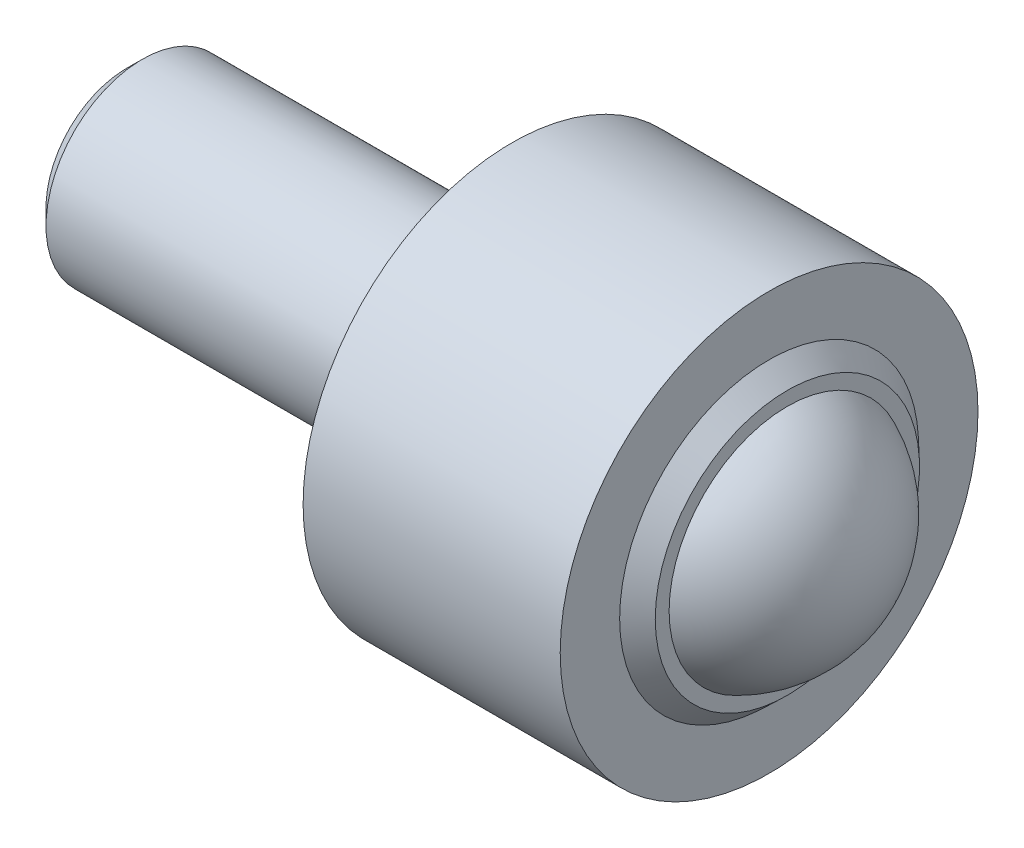
ISO-10303-21;
HEADER;
FILE_DESCRIPTION(('STEP AP214'),'2;1');
FILE_NAME('part.step','',(''),(''),'','','');
FILE_SCHEMA(('AUTOMOTIVE_DESIGN { 1 0 10303 214 1 1 1 1 }'));
ENDSEC;
DATA;
#1=APPLICATION_CONTEXT('core data for automotive mechanical design processes');
#2=APPLICATION_PROTOCOL_DEFINITION('international standard','automotive_design',2000,#1);
#3=PRODUCT_CONTEXT('',#1,'mechanical');
#4=PRODUCT('Part','Part','',(#3));
#5=PRODUCT_RELATED_PRODUCT_CATEGORY('part','',(#4));
#6=PRODUCT_DEFINITION_FORMATION('','',#4);
#7=PRODUCT_DEFINITION_CONTEXT('part definition',#1,'design');
#8=PRODUCT_DEFINITION('design','',#6,#7);
#9=PRODUCT_DEFINITION_SHAPE('','',#8);
#10=(LENGTH_UNIT() NAMED_UNIT(*) SI_UNIT(.MILLI.,.METRE.));
#11=(NAMED_UNIT(*) PLANE_ANGLE_UNIT() SI_UNIT($,.RADIAN.));
#12=(NAMED_UNIT(*) SI_UNIT($,.STERADIAN.) SOLID_ANGLE_UNIT());
#13=UNCERTAINTY_MEASURE_WITH_UNIT(LENGTH_MEASURE(1.E-05),#10,'distance_accuracy_value','');
#14=(GEOMETRIC_REPRESENTATION_CONTEXT(3) GLOBAL_UNCERTAINTY_ASSIGNED_CONTEXT((#13)) GLOBAL_UNIT_ASSIGNED_CONTEXT((#10,
#11,#12)) REPRESENTATION_CONTEXT('',''));
#15=CARTESIAN_POINT('',(0.,0.,0.));
#16=DIRECTION('',(0.,0.,1.));
#17=DIRECTION('',(1.,0.,0.));
#18=AXIS2_PLACEMENT_3D('',#15,#16,#17);
#19=CARTESIAN_POINT('',(12.,0.,0.));
#20=DIRECTION('',(-1.,0.,0.));
#21=DIRECTION('',(0.,0.,1.));
#22=AXIS2_PLACEMENT_3D('',#19,#20,#21);
#23=CYLINDRICAL_SURFACE('',#22,3.);
#24=CARTESIAN_POINT('',(0.5,0.,0.));
#25=DIRECTION('',(1.,0.,0.));
#26=DIRECTION('',(0.,0.,-1.));
#27=AXIS2_PLACEMENT_3D('',#24,#25,#26);
#28=CIRCLE('',#27,3.);
#29=CARTESIAN_POINT('',(0.5,0.,-3.));
#30=VERTEX_POINT('',#29);
#31=EDGE_CURVE('E39',#30,#30,#28,.T.);
#32=ORIENTED_EDGE('',*,*,#31,.T.);
#33=EDGE_LOOP('',(#32));
#34=FACE_BOUND('',#33,.T.);
#35=CARTESIAN_POINT('',(12.,0.,0.));
#36=DIRECTION('',(1.,0.,0.));
#37=DIRECTION('',(0.,0.,-1.));
#38=AXIS2_PLACEMENT_3D('',#35,#36,#37);
#39=CIRCLE('',#38,3.);
#40=CARTESIAN_POINT('',(12.,0.,-3.));
#41=VERTEX_POINT('',#40);
#42=EDGE_CURVE('E43',#41,#41,#39,.T.);
#43=ORIENTED_EDGE('',*,*,#42,.F.);
#44=EDGE_LOOP('',(#43));
#45=FACE_BOUND('',#44,.T.);
#46=ADVANCED_FACE('F32',(#34,#45),#23,.T.);
#47=CARTESIAN_POINT('',(0.,0.,0.));
#48=DIRECTION('',(1.,0.,0.));
#49=DIRECTION('',(0.,0.,-1.));
#50=AXIS2_PLACEMENT_3D('',#47,#48,#49);
#51=PLANE('',#50);
#52=CARTESIAN_POINT('',(0.,0.,0.));
#53=DIRECTION('',(1.,0.,0.));
#54=DIRECTION('',(0.,0.,-1.));
#55=AXIS2_PLACEMENT_3D('',#52,#53,#54);
#56=CIRCLE('',#55,2.5);
#57=CARTESIAN_POINT('',(0.,0.,-2.5));
#58=VERTEX_POINT('',#57);
#59=EDGE_CURVE('E10',#58,#58,#56,.F.);
#60=ORIENTED_EDGE('',*,*,#59,.T.);
#61=EDGE_LOOP('',(#60));
#62=FACE_BOUND('',#61,.T.);
#63=ADVANCED_FACE('F92',(#62),#51,.F.);
#64=CARTESIAN_POINT('',(20.,0.,0.));
#65=DIRECTION('',(-1.,0.,0.));
#66=DIRECTION('',(0.,0.,1.));
#67=AXIS2_PLACEMENT_3D('',#64,#65,#66);
#68=CYLINDRICAL_SURFACE('',#67,6.5);
#69=CARTESIAN_POINT('',(20.,0.,0.));
#70=DIRECTION('',(1.,0.,0.));
#71=DIRECTION('',(0.,0.,-1.));
#72=AXIS2_PLACEMENT_3D('',#69,#70,#71);
#73=CIRCLE('',#72,6.5);
#74=CARTESIAN_POINT('',(20.,0.,-6.5));
#75=VERTEX_POINT('',#74);
#76=EDGE_CURVE('E47',#75,#75,#73,.T.);
#77=ORIENTED_EDGE('',*,*,#76,.F.);
#78=EDGE_LOOP('',(#77));
#79=FACE_BOUND('',#78,.T.);
#80=CARTESIAN_POINT('',(12.,0.,0.));
#81=DIRECTION('',(1.,0.,0.));
#82=DIRECTION('',(0.,0.,-1.));
#83=AXIS2_PLACEMENT_3D('',#80,#81,#82);
#84=CIRCLE('',#83,6.5);
#85=CARTESIAN_POINT('',(12.,0.,-6.5));
#86=VERTEX_POINT('',#85);
#87=EDGE_CURVE('E50',#86,#86,#84,.T.);
#88=ORIENTED_EDGE('',*,*,#87,.T.);
#89=EDGE_LOOP('',(#88));
#90=FACE_BOUND('',#89,.T.);
#91=ADVANCED_FACE('F97',(#79,#90),#68,.T.);
#92=CARTESIAN_POINT('',(20.,0.,0.));
#93=DIRECTION('',(1.,0.,0.));
#94=DIRECTION('',(0.,0.,-1.));
#95=AXIS2_PLACEMENT_3D('',#92,#93,#94);
#96=PLANE('',#95);
#97=CARTESIAN_POINT('',(20.,0.,0.));
#98=DIRECTION('',(-1.,0.,0.));
#99=DIRECTION('',(0.,0.,1.));
#100=AXIS2_PLACEMENT_3D('',#97,#98,#99);
#101=CIRCLE('',#100,4.65086537431426);
#102=CARTESIAN_POINT('',(20.,0.,4.65086537431426));
#103=VERTEX_POINT('',#102);
#104=EDGE_CURVE('E61',#103,#103,#101,.T.);
#105=ORIENTED_EDGE('',*,*,#104,.T.);
#106=EDGE_LOOP('',(#105));
#107=FACE_BOUND('',#106,.T.);
#108=ORIENTED_EDGE('',*,*,#76,.T.);
#109=EDGE_LOOP('',(#108));
#110=FACE_BOUND('',#109,.T.);
#111=ADVANCED_FACE('F65',(#107,#110),#96,.T.);
#112=CARTESIAN_POINT('',(12.,0.,0.));
#113=DIRECTION('',(1.,0.,0.));
#114=DIRECTION('',(0.,0.,-1.));
#115=AXIS2_PLACEMENT_3D('',#112,#113,#114);
#116=PLANE('',#115);
#117=ORIENTED_EDGE('',*,*,#42,.T.);
#118=EDGE_LOOP('',(#117));
#119=FACE_BOUND('',#118,.T.);
#120=ORIENTED_EDGE('',*,*,#87,.F.);
#121=EDGE_LOOP('',(#120));
#122=FACE_BOUND('',#121,.T.);
#123=ADVANCED_FACE('F82',(#119,#122),#116,.F.);
#124=CARTESIAN_POINT('',(19.,0.,0.));
#125=DIRECTION('',(-1.,0.,0.));
#126=DIRECTION('',(0.,0.,1.));
#127=AXIS2_PLACEMENT_3D('',#124,#125,#126);
#128=SPHERICAL_SURFACE('',#127,4.);
#129=CARTESIAN_POINT('',(20.5681338920704,0.,0.));
#130=DIRECTION('',(-1.,0.,0.));
#131=DIRECTION('',(0.,0.,1.));
#132=AXIS2_PLACEMENT_3D('',#129,#130,#131);
#133=CIRCLE('',#132,3.6798038122351);
#134=CARTESIAN_POINT('',(20.5681338920704,0.,3.6798038122351));
#135=VERTEX_POINT('',#134);
#136=EDGE_CURVE('E53',#135,#135,#133,.T.);
#137=ORIENTED_EDGE('',*,*,#136,.F.);
#138=EDGE_LOOP('',(#137));
#139=FACE_BOUND('',#138,.T.);
#140=ADVANCED_FACE('F77',(#139),#128,.T.);
#141=CARTESIAN_POINT('',(20.5681338920704,0.,-4.11099415781164));
#142=DIRECTION('',(-1.,0.,0.));
#143=DIRECTION('',(0.,0.,1.));
#144=AXIS2_PLACEMENT_3D('',#141,#142,#143);
#145=PLANE('',#144);
#146=CARTESIAN_POINT('',(20.5681338920704,0.,0.));
#147=DIRECTION('',(-1.,0.,0.));
#148=DIRECTION('',(0.,0.,1.));
#149=AXIS2_PLACEMENT_3D('',#146,#147,#148);
#150=CIRCLE('',#149,4.11099415781164);
#151=CARTESIAN_POINT('',(20.5681338920704,0.,4.11099415781164));
#152=VERTEX_POINT('',#151);
#153=EDGE_CURVE('E58',#152,#152,#150,.T.);
#154=ORIENTED_EDGE('',*,*,#153,.F.);
#155=EDGE_LOOP('',(#154));
#156=FACE_BOUND('',#155,.T.);
#157=ORIENTED_EDGE('',*,*,#136,.T.);
#158=EDGE_LOOP('',(#157));
#159=FACE_BOUND('',#158,.T.);
#160=ADVANCED_FACE('F71',(#156,#159),#145,.F.);
#161=CARTESIAN_POINT('',(20.5681338920704,0.,0.));
#162=DIRECTION('',(-1.,0.,0.));
#163=DIRECTION('',(0.,0.,1.));
#164=AXIS2_PLACEMENT_3D('',#161,#162,#163);
#165=CONICAL_SURFACE('',#164,4.11099415781164,0.759895981051894);
#166=ORIENTED_EDGE('',*,*,#104,.F.);
#167=EDGE_LOOP('',(#166));
#168=FACE_BOUND('',#167,.T.);
#169=ORIENTED_EDGE('',*,*,#153,.T.);
#170=EDGE_LOOP('',(#169));
#171=FACE_BOUND('',#170,.T.);
#172=ADVANCED_FACE('F68',(#168,#171),#165,.T.);
#173=CARTESIAN_POINT('',(0.5,0.,0.));
#174=DIRECTION('',(1.,0.,0.));
#175=DIRECTION('',(0.,0.,-1.));
#176=AXIS2_PLACEMENT_3D('',#173,#174,#175);
#177=CONICAL_SURFACE('',#176,3.,0.785398163397452);
#178=ORIENTED_EDGE('',*,*,#59,.F.);
#179=EDGE_LOOP('',(#178));
#180=FACE_BOUND('',#179,.T.);
#181=ORIENTED_EDGE('',*,*,#31,.F.);
#182=EDGE_LOOP('',(#181));
#183=FACE_BOUND('',#182,.T.);
#184=ADVANCED_FACE('F34',(#180,#183),#177,.T.);
#185=CLOSED_SHELL('',(#46,#63,#91,#111,#123,#140,#160,#172,#184));
#186=MANIFOLD_SOLID_BREP('B2',#185);
#187=ADVANCED_BREP_SHAPE_REPRESENTATION('',(#18,#186),#14);
#188=SHAPE_DEFINITION_REPRESENTATION(#9,#187);
ENDSEC;
END-ISO-10303-21;
